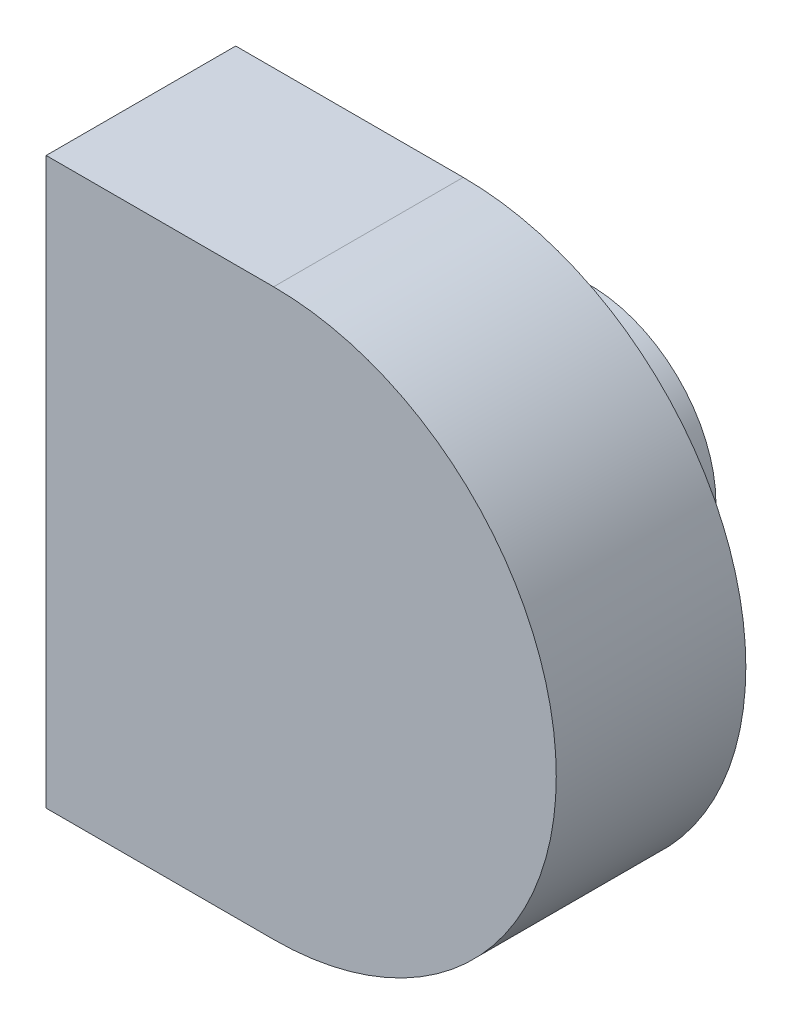
ISO-10303-21;
HEADER;
FILE_DESCRIPTION(('STEP AP214'),'2;1');
FILE_NAME('part.step','',(''),(''),'','','');
FILE_SCHEMA(('AUTOMOTIVE_DESIGN { 1 0 10303 214 1 1 1 1 }'));
ENDSEC;
DATA;
#1=APPLICATION_CONTEXT('core data for automotive mechanical design processes');
#2=APPLICATION_PROTOCOL_DEFINITION('international standard','automotive_design',2000,#1);
#3=PRODUCT_CONTEXT('',#1,'mechanical');
#4=PRODUCT('Part','Part','',(#3));
#5=PRODUCT_RELATED_PRODUCT_CATEGORY('part','',(#4));
#6=PRODUCT_DEFINITION_FORMATION('','',#4);
#7=PRODUCT_DEFINITION_CONTEXT('part definition',#1,'design');
#8=PRODUCT_DEFINITION('design','',#6,#7);
#9=PRODUCT_DEFINITION_SHAPE('','',#8);
#10=(LENGTH_UNIT() NAMED_UNIT(*) SI_UNIT(.MILLI.,.METRE.));
#11=(NAMED_UNIT(*) PLANE_ANGLE_UNIT() SI_UNIT($,.RADIAN.));
#12=(NAMED_UNIT(*) SI_UNIT($,.STERADIAN.) SOLID_ANGLE_UNIT());
#13=UNCERTAINTY_MEASURE_WITH_UNIT(LENGTH_MEASURE(1.E-05),#10,'distance_accuracy_value','');
#14=(GEOMETRIC_REPRESENTATION_CONTEXT(3) GLOBAL_UNCERTAINTY_ASSIGNED_CONTEXT((#13)) GLOBAL_UNIT_ASSIGNED_CONTEXT((#10,
#11,#12)) REPRESENTATION_CONTEXT('',''));
#15=CARTESIAN_POINT('',(0.,0.,0.));
#16=DIRECTION('',(0.,0.,1.));
#17=DIRECTION('',(1.,0.,0.));
#18=AXIS2_PLACEMENT_3D('',#15,#16,#17);
#19=CARTESIAN_POINT('',(18.,22.365,-10.));
#20=DIRECTION('',(0.,0.,1.));
#21=DIRECTION('',(1.,0.,0.));
#22=AXIS2_PLACEMENT_3D('',#19,#20,#21);
#23=CYLINDRICAL_SURFACE('',#22,10.);
#24=CARTESIAN_POINT('',(18.,22.365,-2.5));
#25=DIRECTION('',(0.,0.,-1.));
#26=DIRECTION('',(-1.,0.,0.));
#27=AXIS2_PLACEMENT_3D('',#24,#25,#26);
#28=CIRCLE('',#27,10.);
#29=CARTESIAN_POINT('',(7.99999999999998,22.365,-2.5));
#30=VERTEX_POINT('',#29);
#31=EDGE_CURVE('E146',#30,#30,#28,.T.);
#32=ORIENTED_EDGE('',*,*,#31,.T.);
#33=EDGE_LOOP('',(#32));
#34=FACE_BOUND('',#33,.T.);
#35=CARTESIAN_POINT('',(18.,22.365,-10.));
#36=DIRECTION('',(0.,0.,-1.));
#37=DIRECTION('',(-1.,0.,0.));
#38=AXIS2_PLACEMENT_3D('',#35,#36,#37);
#39=CIRCLE('',#38,10.);
#40=CARTESIAN_POINT('',(7.99999999999998,22.365,-10.));
#41=VERTEX_POINT('',#40);
#42=EDGE_CURVE('E114',#41,#41,#39,.T.);
#43=ORIENTED_EDGE('',*,*,#42,.F.);
#44=EDGE_LOOP('',(#43));
#45=FACE_BOUND('',#44,.T.);
#46=ADVANCED_FACE('F44',(#34,#45),#23,.T.);
#47=CARTESIAN_POINT('',(0.,0.,-10.));
#48=DIRECTION('',(0.,0.,-1.));
#49=DIRECTION('',(-1.,0.,0.));
#50=AXIS2_PLACEMENT_3D('',#47,#48,#49);
#51=PLANE('',#50);
#52=CARTESIAN_POINT('',(18.,29.365,-10.));
#53=DIRECTION('',(0.,0.,-1.));
#54=DIRECTION('',(-1.,0.,0.));
#55=AXIS2_PLACEMENT_3D('',#52,#53,#54);
#56=CIRCLE('',#55,0.999999999999998);
#57=CARTESIAN_POINT('',(17.,29.365,-10.));
#58=VERTEX_POINT('',#57);
#59=EDGE_CURVE('E136',#58,#58,#56,.T.);
#60=ORIENTED_EDGE('',*,*,#59,.F.);
#61=EDGE_LOOP('',(#60));
#62=FACE_BOUND('',#61,.T.);
#63=CARTESIAN_POINT('',(10.9999999999998,22.3650000000002,-10.));
#64=DIRECTION('',(0.,0.,-1.));
#65=DIRECTION('',(-1.,0.,0.));
#66=AXIS2_PLACEMENT_3D('',#63,#64,#65);
#67=CIRCLE('',#66,0.999999999999997);
#68=CARTESIAN_POINT('',(9.9999999999998,22.3650000000002,-10.));
#69=VERTEX_POINT('',#68);
#70=EDGE_CURVE('E135',#69,#69,#67,.T.);
#71=ORIENTED_EDGE('',*,*,#70,.F.);
#72=EDGE_LOOP('',(#71));
#73=FACE_BOUND('',#72,.T.);
#74=CARTESIAN_POINT('',(17.9999999999996,15.365,-10.));
#75=DIRECTION('',(0.,0.,-1.));
#76=DIRECTION('',(-1.,0.,0.));
#77=AXIS2_PLACEMENT_3D('',#74,#75,#76);
#78=CIRCLE('',#77,1.);
#79=CARTESIAN_POINT('',(16.9999999999996,15.365,-10.));
#80=VERTEX_POINT('',#79);
#81=EDGE_CURVE('E128',#80,#80,#78,.T.);
#82=ORIENTED_EDGE('',*,*,#81,.F.);
#83=EDGE_LOOP('',(#82));
#84=FACE_BOUND('',#83,.T.);
#85=CARTESIAN_POINT('',(24.9999999999998,22.3649999999999,-10.));
#86=DIRECTION('',(0.,0.,-1.));
#87=DIRECTION('',(-1.,0.,0.));
#88=AXIS2_PLACEMENT_3D('',#85,#86,#87);
#89=CIRCLE('',#88,0.999999999999999);
#90=CARTESIAN_POINT('',(23.9999999999998,22.3649999999999,-10.));
#91=VERTEX_POINT('',#90);
#92=EDGE_CURVE('E125',#91,#91,#89,.T.);
#93=ORIENTED_EDGE('',*,*,#92,.F.);
#94=EDGE_LOOP('',(#93));
#95=FACE_BOUND('',#94,.T.);
#96=ORIENTED_EDGE('',*,*,#42,.T.);
#97=EDGE_LOOP('',(#96));
#98=FACE_BOUND('',#97,.T.);
#99=ADVANCED_FACE('F171',(#62,#73,#84,#95,#98),#51,.T.);
#100=CARTESIAN_POINT('',(24.9999999999998,22.3649999999999,-5.));
#101=DIRECTION('',(0.,0.,-1.));
#102=DIRECTION('',(-1.,0.,0.));
#103=AXIS2_PLACEMENT_3D('',#100,#101,#102);
#104=CYLINDRICAL_SURFACE('',#103,0.999999999999999);
#105=CARTESIAN_POINT('',(24.9999999999998,22.3649999999999,-5.));
#106=DIRECTION('',(0.,0.,-1.));
#107=DIRECTION('',(-1.,0.,0.));
#108=AXIS2_PLACEMENT_3D('',#105,#106,#107);
#109=CIRCLE('',#108,0.999999999999999);
#110=CARTESIAN_POINT('',(23.9999999999998,22.3649999999999,-5.));
#111=VERTEX_POINT('',#110);
#112=EDGE_CURVE('E118',#111,#111,#109,.T.);
#113=ORIENTED_EDGE('',*,*,#112,.F.);
#114=EDGE_LOOP('',(#113));
#115=FACE_BOUND('',#114,.T.);
#116=ORIENTED_EDGE('',*,*,#92,.T.);
#117=EDGE_LOOP('',(#116));
#118=FACE_BOUND('',#117,.T.);
#119=ADVANCED_FACE('F176',(#115,#118),#104,.F.);
#120=CARTESIAN_POINT('',(24.9999999999998,22.3649999999999,-5.));
#121=DIRECTION('',(0.,0.,-1.));
#122=DIRECTION('',(-1.,0.,0.));
#123=AXIS2_PLACEMENT_3D('',#120,#121,#122);
#124=PLANE('',#123);
#125=ORIENTED_EDGE('',*,*,#112,.T.);
#126=EDGE_LOOP('',(#125));
#127=FACE_BOUND('',#126,.T.);
#128=ADVANCED_FACE('F286',(#127),#124,.T.);
#129=CARTESIAN_POINT('',(17.9999999999996,15.365,-5.));
#130=DIRECTION('',(0.,0.,-1.));
#131=DIRECTION('',(-1.,0.,0.));
#132=AXIS2_PLACEMENT_3D('',#129,#130,#131);
#133=CYLINDRICAL_SURFACE('',#132,1.);
#134=CARTESIAN_POINT('',(17.9999999999996,15.365,-5.));
#135=DIRECTION('',(0.,0.,-1.));
#136=DIRECTION('',(-1.,0.,0.));
#137=AXIS2_PLACEMENT_3D('',#134,#135,#136);
#138=CIRCLE('',#137,1.);
#139=CARTESIAN_POINT('',(16.9999999999996,15.365,-5.));
#140=VERTEX_POINT('',#139);
#141=EDGE_CURVE('E126',#140,#140,#138,.T.);
#142=ORIENTED_EDGE('',*,*,#141,.F.);
#143=EDGE_LOOP('',(#142));
#144=FACE_BOUND('',#143,.T.);
#145=ORIENTED_EDGE('',*,*,#81,.T.);
#146=EDGE_LOOP('',(#145));
#147=FACE_BOUND('',#146,.T.);
#148=ADVANCED_FACE('F279',(#144,#147),#133,.F.);
#149=CARTESIAN_POINT('',(17.9999999999996,15.365,-5.));
#150=DIRECTION('',(0.,0.,-1.));
#151=DIRECTION('',(-1.,0.,0.));
#152=AXIS2_PLACEMENT_3D('',#149,#150,#151);
#153=PLANE('',#152);
#154=ORIENTED_EDGE('',*,*,#141,.T.);
#155=EDGE_LOOP('',(#154));
#156=FACE_BOUND('',#155,.T.);
#157=ADVANCED_FACE('F266',(#156),#153,.T.);
#158=CARTESIAN_POINT('',(10.9999999999998,22.3650000000002,-5.));
#159=DIRECTION('',(0.,0.,-1.));
#160=DIRECTION('',(-1.,0.,0.));
#161=AXIS2_PLACEMENT_3D('',#158,#159,#160);
#162=CYLINDRICAL_SURFACE('',#161,0.999999999999997);
#163=CARTESIAN_POINT('',(10.9999999999998,22.3650000000002,-5.));
#164=DIRECTION('',(0.,0.,-1.));
#165=DIRECTION('',(-1.,0.,0.));
#166=AXIS2_PLACEMENT_3D('',#163,#164,#165);
#167=CIRCLE('',#166,0.999999999999997);
#168=CARTESIAN_POINT('',(9.9999999999998,22.3650000000002,-5.));
#169=VERTEX_POINT('',#168);
#170=EDGE_CURVE('E132',#169,#169,#167,.T.);
#171=ORIENTED_EDGE('',*,*,#170,.F.);
#172=EDGE_LOOP('',(#171));
#173=FACE_BOUND('',#172,.T.);
#174=ORIENTED_EDGE('',*,*,#70,.T.);
#175=EDGE_LOOP('',(#174));
#176=FACE_BOUND('',#175,.T.);
#177=ADVANCED_FACE('F259',(#173,#176),#162,.F.);
#178=CARTESIAN_POINT('',(10.9999999999998,22.3650000000002,-5.));
#179=DIRECTION('',(0.,0.,-1.));
#180=DIRECTION('',(-1.,0.,0.));
#181=AXIS2_PLACEMENT_3D('',#178,#179,#180);
#182=PLANE('',#181);
#183=ORIENTED_EDGE('',*,*,#170,.T.);
#184=EDGE_LOOP('',(#183));
#185=FACE_BOUND('',#184,.T.);
#186=ADVANCED_FACE('F247',(#185),#182,.T.);
#187=CARTESIAN_POINT('',(18.,29.365,-5.));
#188=DIRECTION('',(0.,0.,-1.));
#189=DIRECTION('',(-1.,0.,0.));
#190=AXIS2_PLACEMENT_3D('',#187,#188,#189);
#191=CYLINDRICAL_SURFACE('',#190,0.999999999999998);
#192=CARTESIAN_POINT('',(18.,29.365,-5.));
#193=DIRECTION('',(0.,0.,-1.));
#194=DIRECTION('',(-1.,0.,0.));
#195=AXIS2_PLACEMENT_3D('',#192,#193,#194);
#196=CIRCLE('',#195,0.999999999999998);
#197=CARTESIAN_POINT('',(17.,29.365,-5.));
#198=VERTEX_POINT('',#197);
#199=EDGE_CURVE('E117',#198,#198,#196,.T.);
#200=ORIENTED_EDGE('',*,*,#199,.F.);
#201=EDGE_LOOP('',(#200));
#202=FACE_BOUND('',#201,.T.);
#203=ORIENTED_EDGE('',*,*,#59,.T.);
#204=EDGE_LOOP('',(#203));
#205=FACE_BOUND('',#204,.T.);
#206=ADVANCED_FACE('F166',(#202,#205),#191,.F.);
#207=CARTESIAN_POINT('',(18.,29.365,-5.));
#208=DIRECTION('',(0.,0.,-1.));
#209=DIRECTION('',(-1.,0.,0.));
#210=AXIS2_PLACEMENT_3D('',#207,#208,#209);
#211=PLANE('',#210);
#212=ORIENTED_EDGE('',*,*,#199,.T.);
#213=EDGE_LOOP('',(#212));
#214=FACE_BOUND('',#213,.T.);
#215=ADVANCED_FACE('F160',(#214),#211,.T.);
#216=CARTESIAN_POINT('',(18.,22.365,-2.5));
#217=DIRECTION('',(0.,0.,-1.));
#218=DIRECTION('',(-1.,0.,0.));
#219=AXIS2_PLACEMENT_3D('',#216,#217,#218);
#220=PLANE('',#219);
#221=CARTESIAN_POINT('',(18.,22.365,-2.5));
#222=DIRECTION('',(0.,0.,-1.));
#223=DIRECTION('',(-1.,0.,0.));
#224=AXIS2_PLACEMENT_3D('',#221,#222,#223);
#225=CIRCLE('',#224,12.);
#226=CARTESIAN_POINT('',(5.99999999999998,22.365,-2.5));
#227=VERTEX_POINT('',#226);
#228=EDGE_CURVE('E124',#227,#227,#225,.T.);
#229=ORIENTED_EDGE('',*,*,#228,.T.);
#230=EDGE_LOOP('',(#229));
#231=FACE_BOUND('',#230,.T.);
#232=ORIENTED_EDGE('',*,*,#31,.F.);
#233=EDGE_LOOP('',(#232));
#234=FACE_BOUND('',#233,.T.);
#235=ADVANCED_FACE('F153',(#231,#234),#220,.T.);
#236=CARTESIAN_POINT('',(18.,22.365,-2.5));
#237=DIRECTION('',(0.,0.,1.));
#238=DIRECTION('',(1.,0.,0.));
#239=AXIS2_PLACEMENT_3D('',#236,#237,#238);
#240=CYLINDRICAL_SURFACE('',#239,12.);
#241=ORIENTED_EDGE('',*,*,#228,.F.);
#242=EDGE_LOOP('',(#241));
#243=FACE_BOUND('',#242,.T.);
#244=CARTESIAN_POINT('',(18.,22.365,0.));
#245=DIRECTION('',(0.,0.,-1.));
#246=DIRECTION('',(-1.,0.,0.));
#247=AXIS2_PLACEMENT_3D('',#244,#245,#246);
#248=CIRCLE('',#247,12.);
#249=CARTESIAN_POINT('',(5.99999999999998,22.365,0.));
#250=VERTEX_POINT('',#249);
#251=EDGE_CURVE('E141',#250,#250,#248,.T.);
#252=ORIENTED_EDGE('',*,*,#251,.T.);
#253=EDGE_LOOP('',(#252));
#254=FACE_BOUND('',#253,.T.);
#255=ADVANCED_FACE('F158',(#243,#254),#240,.T.);
#256=CARTESIAN_POINT('',(0.,0.,15.));
#257=DIRECTION('',(0.,0.,-1.));
#258=DIRECTION('',(-1.,0.,0.));
#259=AXIS2_PLACEMENT_3D('',#256,#257,#258);
#260=PLANE('',#259);
#261=CARTESIAN_POINT('',(18.,22.365,15.));
#262=DIRECTION('',(0.,0.,1.));
#263=DIRECTION('',(1.,0.,0.));
#264=AXIS2_PLACEMENT_3D('',#261,#262,#263);
#265=CIRCLE('',#264,22.365);
#266=CARTESIAN_POINT('',(18.,0.,15.));
#267=VERTEX_POINT('',#266);
#268=CARTESIAN_POINT('',(18.,44.73,15.));
#269=VERTEX_POINT('',#268);
#270=EDGE_CURVE('E109',#267,#269,#265,.T.);
#271=ORIENTED_EDGE('',*,*,#270,.T.);
#272=DIRECTION('',(-1.,0.,0.));
#273=VECTOR('',#272,1.);
#274=CARTESIAN_POINT('',(0.,44.73,15.));
#275=LINE('',#274,#273);
#276=CARTESIAN_POINT('',(0.,44.73,15.));
#277=VERTEX_POINT('',#276);
#278=EDGE_CURVE('E68',#269,#277,#275,.T.);
#279=ORIENTED_EDGE('',*,*,#278,.T.);
#280=DIRECTION('',(0.,-1.,0.));
#281=VECTOR('',#280,1.);
#282=CARTESIAN_POINT('',(0.,0.,15.));
#283=LINE('',#282,#281);
#284=CARTESIAN_POINT('',(0.,0.,15.));
#285=VERTEX_POINT('',#284);
#286=EDGE_CURVE('E95',#277,#285,#283,.T.);
#287=ORIENTED_EDGE('',*,*,#286,.T.);
#288=DIRECTION('',(1.,0.,0.));
#289=VECTOR('',#288,1.);
#290=CARTESIAN_POINT('',(0.,0.,15.));
#291=LINE('',#290,#289);
#292=EDGE_CURVE('E106',#285,#267,#291,.T.);
#293=ORIENTED_EDGE('',*,*,#292,.T.);
#294=EDGE_LOOP('',(#271,#279,#287,#293));
#295=FACE_BOUND('',#294,.T.);
#296=ADVANCED_FACE('F165',(#295),#260,.F.);
#297=CARTESIAN_POINT('',(0.,0.,15.));
#298=DIRECTION('',(1.,0.,0.));
#299=DIRECTION('',(0.,0.,-1.));
#300=AXIS2_PLACEMENT_3D('',#297,#298,#299);
#301=PLANE('',#300);
#302=DIRECTION('',(0.,-1.,0.));
#303=VECTOR('',#302,1.);
#304=CARTESIAN_POINT('',(0.,0.,0.));
#305=LINE('',#304,#303);
#306=CARTESIAN_POINT('',(0.,44.73,0.));
#307=VERTEX_POINT('',#306);
#308=CARTESIAN_POINT('',(0.,0.,0.));
#309=VERTEX_POINT('',#308);
#310=EDGE_CURVE('E96',#307,#309,#305,.T.);
#311=ORIENTED_EDGE('',*,*,#310,.T.);
#312=DIRECTION('',(0.,0.,-1.));
#313=VECTOR('',#312,1.);
#314=CARTESIAN_POINT('',(0.,0.,15.));
#315=LINE('',#314,#313);
#316=EDGE_CURVE('E11',#285,#309,#315,.T.);
#317=ORIENTED_EDGE('',*,*,#316,.F.);
#318=ORIENTED_EDGE('',*,*,#286,.F.);
#319=DIRECTION('',(0.,0.,-1.));
#320=VECTOR('',#319,1.);
#321=CARTESIAN_POINT('',(0.,44.73,15.));
#322=LINE('',#321,#320);
#323=EDGE_CURVE('E52',#277,#307,#322,.T.);
#324=ORIENTED_EDGE('',*,*,#323,.T.);
#325=EDGE_LOOP('',(#311,#317,#318,#324));
#326=FACE_BOUND('',#325,.T.);
#327=ADVANCED_FACE('F50',(#326),#301,.F.);
#328=CARTESIAN_POINT('',(0.,0.,15.));
#329=DIRECTION('',(0.,1.,0.));
#330=DIRECTION('',(0.,0.,1.));
#331=AXIS2_PLACEMENT_3D('',#328,#329,#330);
#332=PLANE('',#331);
#333=DIRECTION('',(1.,0.,0.));
#334=VECTOR('',#333,1.);
#335=CARTESIAN_POINT('',(0.,0.,0.));
#336=LINE('',#335,#334);
#337=CARTESIAN_POINT('',(18.,0.,0.));
#338=VERTEX_POINT('',#337);
#339=EDGE_CURVE('E91',#309,#338,#336,.T.);
#340=ORIENTED_EDGE('',*,*,#339,.T.);
#341=DIRECTION('',(0.,0.,1.));
#342=VECTOR('',#341,1.);
#343=CARTESIAN_POINT('',(18.,0.,-0.000999999999999265));
#344=LINE('',#343,#342);
#345=EDGE_CURVE('E58',#338,#267,#344,.T.);
#346=ORIENTED_EDGE('',*,*,#345,.T.);
#347=ORIENTED_EDGE('',*,*,#292,.F.);
#348=ORIENTED_EDGE('',*,*,#316,.T.);
#349=EDGE_LOOP('',(#340,#346,#347,#348));
#350=FACE_BOUND('',#349,.T.);
#351=ADVANCED_FACE('F183',(#350),#332,.F.);
#352=CARTESIAN_POINT('',(18.,22.365,-0.000999999999999265));
#353=DIRECTION('',(0.,0.,1.));
#354=DIRECTION('',(1.,0.,0.));
#355=AXIS2_PLACEMENT_3D('',#352,#353,#354);
#356=CYLINDRICAL_SURFACE('',#355,22.365);
#357=CARTESIAN_POINT('',(18.,22.365,0.));
#358=DIRECTION('',(0.,0.,-1.));
#359=DIRECTION('',(-1.,0.,0.));
#360=AXIS2_PLACEMENT_3D('',#357,#358,#359);
#361=CIRCLE('',#360,22.365);
#362=CARTESIAN_POINT('',(18.,44.73,0.));
#363=VERTEX_POINT('',#362);
#364=EDGE_CURVE('E113',#338,#363,#361,.F.);
#365=ORIENTED_EDGE('',*,*,#364,.T.);
#366=DIRECTION('',(0.,0.,1.));
#367=VECTOR('',#366,1.);
#368=CARTESIAN_POINT('',(18.,44.73,-0.000999999999999265));
#369=LINE('',#368,#367);
#370=EDGE_CURVE('E88',#363,#269,#369,.T.);
#371=ORIENTED_EDGE('',*,*,#370,.T.);
#372=ORIENTED_EDGE('',*,*,#270,.F.);
#373=ORIENTED_EDGE('',*,*,#345,.F.);
#374=EDGE_LOOP('',(#365,#371,#372,#373));
#375=FACE_BOUND('',#374,.T.);
#376=ADVANCED_FACE('F181',(#375),#356,.T.);
#377=CARTESIAN_POINT('',(0.,44.73,15.));
#378=DIRECTION('',(0.,-1.,0.));
#379=DIRECTION('',(0.,0.,-1.));
#380=AXIS2_PLACEMENT_3D('',#377,#378,#379);
#381=PLANE('',#380);
#382=ORIENTED_EDGE('',*,*,#370,.F.);
#383=DIRECTION('',(-1.,0.,0.));
#384=VECTOR('',#383,1.);
#385=CARTESIAN_POINT('',(0.,44.73,0.));
#386=LINE('',#385,#384);
#387=EDGE_CURVE('E84',#363,#307,#386,.T.);
#388=ORIENTED_EDGE('',*,*,#387,.T.);
#389=ORIENTED_EDGE('',*,*,#323,.F.);
#390=ORIENTED_EDGE('',*,*,#278,.F.);
#391=EDGE_LOOP('',(#382,#388,#389,#390));
#392=FACE_BOUND('',#391,.T.);
#393=ADVANCED_FACE('F85',(#392),#381,.F.);
#394=CARTESIAN_POINT('',(0.,0.,0.));
#395=DIRECTION('',(0.,0.,-1.));
#396=DIRECTION('',(-1.,0.,0.));
#397=AXIS2_PLACEMENT_3D('',#394,#395,#396);
#398=PLANE('',#397);
#399=ORIENTED_EDGE('',*,*,#251,.F.);
#400=EDGE_LOOP('',(#399));
#401=FACE_BOUND('',#400,.T.);
#402=ORIENTED_EDGE('',*,*,#387,.F.);
#403=ORIENTED_EDGE('',*,*,#364,.F.);
#404=ORIENTED_EDGE('',*,*,#339,.F.);
#405=ORIENTED_EDGE('',*,*,#310,.F.);
#406=EDGE_LOOP('',(#402,#403,#404,#405));
#407=FACE_BOUND('',#406,.T.);
#408=ADVANCED_FACE('F100',(#401,#407),#398,.T.);
#409=CLOSED_SHELL('',(#46,#99,#119,#128,#148,#157,#177,#186,#206,#215,#235,#255,#296,#327,#351,
#376,#393,#408));
#410=MANIFOLD_SOLID_BREP('B2',#409);
#411=ADVANCED_BREP_SHAPE_REPRESENTATION('',(#18,#410),#14);
#412=SHAPE_DEFINITION_REPRESENTATION(#9,#411);
ENDSEC;
END-ISO-10303-21;
